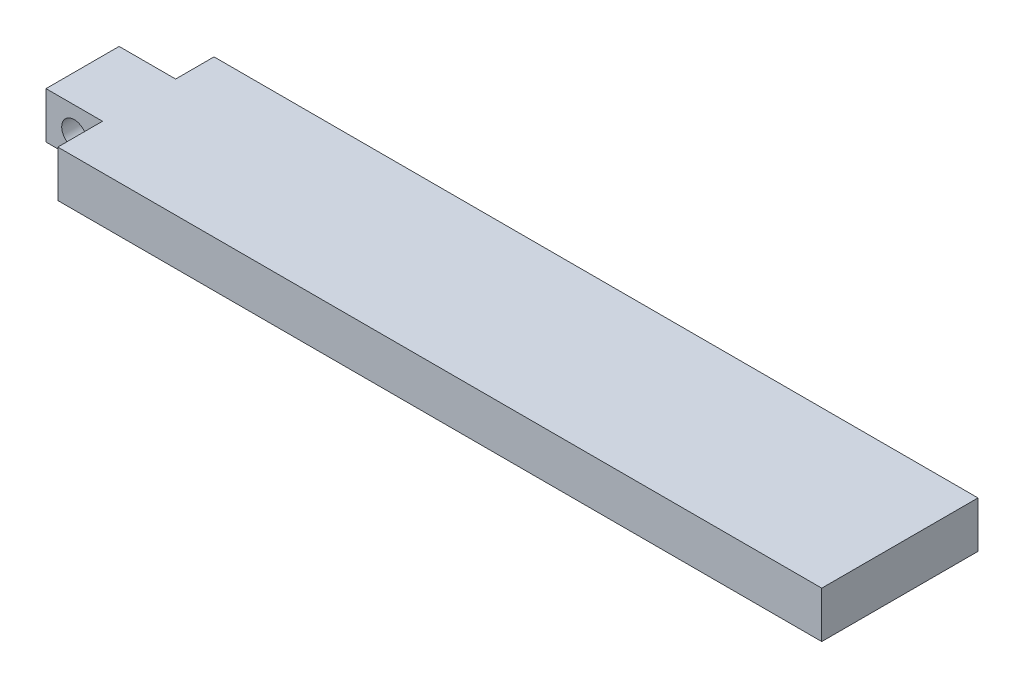
ISO-10303-21;
HEADER;
FILE_DESCRIPTION(('STEP AP214'),'2;1');
FILE_NAME('part.step','',(''),(''),'','','');
FILE_SCHEMA(('AUTOMOTIVE_DESIGN { 1 0 10303 214 1 1 1 1 }'));
ENDSEC;
DATA;
#1=APPLICATION_CONTEXT('core data for automotive mechanical design processes');
#2=APPLICATION_PROTOCOL_DEFINITION('international standard','automotive_design',2000,#1);
#3=PRODUCT_CONTEXT('',#1,'mechanical');
#4=PRODUCT('Part','Part','',(#3));
#5=PRODUCT_RELATED_PRODUCT_CATEGORY('part','',(#4));
#6=PRODUCT_DEFINITION_FORMATION('','',#4);
#7=PRODUCT_DEFINITION_CONTEXT('part definition',#1,'design');
#8=PRODUCT_DEFINITION('design','',#6,#7);
#9=PRODUCT_DEFINITION_SHAPE('','',#8);
#10=(LENGTH_UNIT() NAMED_UNIT(*) SI_UNIT(.MILLI.,.METRE.));
#11=(NAMED_UNIT(*) PLANE_ANGLE_UNIT() SI_UNIT($,.RADIAN.));
#12=(NAMED_UNIT(*) SI_UNIT($,.STERADIAN.) SOLID_ANGLE_UNIT());
#13=UNCERTAINTY_MEASURE_WITH_UNIT(LENGTH_MEASURE(1.E-05),#10,'distance_accuracy_value','');
#14=(GEOMETRIC_REPRESENTATION_CONTEXT(3) GLOBAL_UNCERTAINTY_ASSIGNED_CONTEXT((#13)) GLOBAL_UNIT_ASSIGNED_CONTEXT((#10,
#11,#12)) REPRESENTATION_CONTEXT('',''));
#15=CARTESIAN_POINT('',(0.,0.,0.));
#16=DIRECTION('',(0.,0.,1.));
#17=DIRECTION('',(1.,0.,0.));
#18=AXIS2_PLACEMENT_3D('',#15,#16,#17);
#19=CARTESIAN_POINT('',(161.751764330635,4.,-3.86426784554317));
#20=DIRECTION('',(0.,0.,-1.));
#21=DIRECTION('',(1.,0.,0.));
#22=AXIS2_PLACEMENT_3D('',#19,#20,#21);
#23=PLANE('',#22);
#24=CARTESIAN_POINT('',(93.316959872475,1.81723247665775,-3.86426784554317));
#25=DIRECTION('',(0.,0.,-1.));
#26=DIRECTION('',(-1.,0.,0.));
#27=AXIS2_PLACEMENT_3D('',#24,#25,#26);
#28=CIRCLE('',#27,1.08475397364903);
#29=CARTESIAN_POINT('',(92.232205898826,1.81723247665775,-3.86426784554317));
#30=VERTEX_POINT('',#29);
#31=EDGE_CURVE('E174',#30,#30,#28,.T.);
#32=ORIENTED_EDGE('',*,*,#31,.T.);
#33=EDGE_LOOP('',(#32));
#34=FACE_BOUND('',#33,.T.);
#35=DIRECTION('',(-1.,0.,0.));
#36=VECTOR('',#35,1.);
#37=CARTESIAN_POINT('',(161.751764330635,0.,-3.86426784554317));
#38=LINE('',#37,#36);
#39=CARTESIAN_POINT('',(95.7580375796323,0.,-3.86426784554317));
#40=VERTEX_POINT('',#39);
#41=CARTESIAN_POINT('',(90.8758821653177,0.,-3.86426784554317));
#42=VERTEX_POINT('',#41);
#43=EDGE_CURVE('E132',#40,#42,#38,.T.);
#44=ORIENTED_EDGE('',*,*,#43,.F.);
#45=DIRECTION('',(0.,-1.,0.));
#46=VECTOR('',#45,1.);
#47=CARTESIAN_POINT('',(95.7580375796323,4.,-3.86426784554317));
#48=LINE('',#47,#46);
#49=CARTESIAN_POINT('',(95.7580375796323,4.,-3.86426784554317));
#50=VERTEX_POINT('',#49);
#51=EDGE_CURVE('E146',#50,#40,#48,.T.);
#52=ORIENTED_EDGE('',*,*,#51,.F.);
#53=DIRECTION('',(-1.,0.,0.));
#54=VECTOR('',#53,1.);
#55=CARTESIAN_POINT('',(161.751764330635,4.,-3.86426784554317));
#56=LINE('',#55,#54);
#57=CARTESIAN_POINT('',(90.8758821653177,4.,-3.86426784554317));
#58=VERTEX_POINT('',#57);
#59=EDGE_CURVE('E169',#50,#58,#56,.T.);
#60=ORIENTED_EDGE('',*,*,#59,.T.);
#61=DIRECTION('',(0.,-1.,0.));
#62=VECTOR('',#61,1.);
#63=CARTESIAN_POINT('',(90.8758821653177,4.,-3.86426784554317));
#64=LINE('',#63,#62);
#65=EDGE_CURVE('E11',#58,#42,#64,.T.);
#66=ORIENTED_EDGE('',*,*,#65,.T.);
#67=EDGE_LOOP('',(#44,#52,#60,#66));
#68=FACE_BOUND('',#67,.T.);
#69=ADVANCED_FACE('F37',(#34,#68),#23,.F.);
#70=CARTESIAN_POINT('',(90.8758821653177,4.,0.));
#71=DIRECTION('',(1.,0.,0.));
#72=DIRECTION('',(0.,0.,1.));
#73=AXIS2_PLACEMENT_3D('',#70,#71,#72);
#74=PLANE('',#73);
#75=DIRECTION('',(0.,0.,-1.));
#76=VECTOR('',#75,1.);
#77=CARTESIAN_POINT('',(90.8758821653177,0.,0.));
#78=LINE('',#77,#76);
#79=CARTESIAN_POINT('',(90.8758821653177,0.,-10.1795813079235));
#80=VERTEX_POINT('',#79);
#81=EDGE_CURVE('E134',#42,#80,#78,.T.);
#82=ORIENTED_EDGE('',*,*,#81,.F.);
#83=ORIENTED_EDGE('',*,*,#65,.F.);
#84=DIRECTION('',(0.,0.,-1.));
#85=VECTOR('',#84,1.);
#86=CARTESIAN_POINT('',(90.8758821653177,4.,0.));
#87=LINE('',#86,#85);
#88=CARTESIAN_POINT('',(90.8758821653177,4.,-10.1795813079235));
#89=VERTEX_POINT('',#88);
#90=EDGE_CURVE('E92',#58,#89,#87,.T.);
#91=ORIENTED_EDGE('',*,*,#90,.T.);
#92=DIRECTION('',(0.,-1.,0.));
#93=VECTOR('',#92,1.);
#94=CARTESIAN_POINT('',(90.8758821653177,4.,-10.1795813079235));
#95=LINE('',#94,#93);
#96=EDGE_CURVE('E46',#89,#80,#95,.T.);
#97=ORIENTED_EDGE('',*,*,#96,.T.);
#98=EDGE_LOOP('',(#82,#83,#91,#97));
#99=FACE_BOUND('',#98,.T.);
#100=ADVANCED_FACE('F159',(#99),#74,.F.);
#101=CARTESIAN_POINT('',(161.751764330635,4.,-10.1795813079235));
#102=DIRECTION('',(0.,0.,-1.));
#103=DIRECTION('',(1.,0.,0.));
#104=AXIS2_PLACEMENT_3D('',#101,#102,#103);
#105=PLANE('',#104);
#106=CARTESIAN_POINT('',(93.316959872475,1.81723247665775,-10.1795813079235));
#107=DIRECTION('',(0.,0.,1.));
#108=DIRECTION('',(1.,0.,0.));
#109=AXIS2_PLACEMENT_3D('',#106,#107,#108);
#110=CIRCLE('',#109,1.08475397364903);
#111=CARTESIAN_POINT('',(94.401713846124,1.81723247665775,-10.1795813079235));
#112=VERTEX_POINT('',#111);
#113=EDGE_CURVE('E40',#112,#112,#110,.T.);
#114=ORIENTED_EDGE('',*,*,#113,.T.);
#115=EDGE_LOOP('',(#114));
#116=FACE_BOUND('',#115,.T.);
#117=DIRECTION('',(-1.,0.,0.));
#118=VECTOR('',#117,1.);
#119=CARTESIAN_POINT('',(161.751764330635,0.,-10.1795813079235));
#120=LINE('',#119,#118);
#121=CARTESIAN_POINT('',(95.7580375796323,0.,-10.1795813079235));
#122=VERTEX_POINT('',#121);
#123=EDGE_CURVE('E137',#122,#80,#120,.T.);
#124=ORIENTED_EDGE('',*,*,#123,.T.);
#125=ORIENTED_EDGE('',*,*,#96,.F.);
#126=DIRECTION('',(-1.,0.,0.));
#127=VECTOR('',#126,1.);
#128=CARTESIAN_POINT('',(161.751764330635,4.,-10.1795813079235));
#129=LINE('',#128,#127);
#130=CARTESIAN_POINT('',(95.7580375796323,4.,-10.1795813079235));
#131=VERTEX_POINT('',#130);
#132=EDGE_CURVE('E171',#131,#89,#129,.T.);
#133=ORIENTED_EDGE('',*,*,#132,.F.);
#134=DIRECTION('',(0.,-1.,0.));
#135=VECTOR('',#134,1.);
#136=CARTESIAN_POINT('',(95.7580375796323,4.,-10.1795813079235));
#137=LINE('',#136,#135);
#138=EDGE_CURVE('E153',#131,#122,#137,.T.);
#139=ORIENTED_EDGE('',*,*,#138,.T.);
#140=EDGE_LOOP('',(#124,#125,#133,#139));
#141=FACE_BOUND('',#140,.T.);
#142=ADVANCED_FACE('F181',(#116,#141),#105,.T.);
#143=CARTESIAN_POINT('',(95.7580375796323,4.,0.));
#144=DIRECTION('',(-1.,0.,0.));
#145=DIRECTION('',(0.,0.,-1.));
#146=AXIS2_PLACEMENT_3D('',#143,#144,#145);
#147=PLANE('',#146);
#148=DIRECTION('',(0.,0.,1.));
#149=VECTOR('',#148,1.);
#150=CARTESIAN_POINT('',(95.7580375796323,0.,0.));
#151=LINE('',#150,#149);
#152=CARTESIAN_POINT('',(95.7580375796323,0.,-13.498100823404));
#153=VERTEX_POINT('',#152);
#154=EDGE_CURVE('E139',#153,#122,#151,.T.);
#155=ORIENTED_EDGE('',*,*,#154,.T.);
#156=ORIENTED_EDGE('',*,*,#138,.F.);
#157=DIRECTION('',(0.,0.,1.));
#158=VECTOR('',#157,1.);
#159=CARTESIAN_POINT('',(95.7580375796323,4.,0.));
#160=LINE('',#159,#158);
#161=CARTESIAN_POINT('',(95.7580375796323,4.,-13.498100823404));
#162=VERTEX_POINT('',#161);
#163=EDGE_CURVE('E128',#162,#131,#160,.T.);
#164=ORIENTED_EDGE('',*,*,#163,.F.);
#165=DIRECTION('',(0.,-1.,0.));
#166=VECTOR('',#165,1.);
#167=CARTESIAN_POINT('',(95.7580375796323,4.,-13.498100823404));
#168=LINE('',#167,#166);
#169=EDGE_CURVE('E150',#162,#153,#168,.T.);
#170=ORIENTED_EDGE('',*,*,#169,.T.);
#171=EDGE_LOOP('',(#155,#156,#164,#170));
#172=FACE_BOUND('',#171,.T.);
#173=ADVANCED_FACE('F180',(#172),#147,.T.);
#174=CARTESIAN_POINT('',(161.751764330635,4.,-13.498100823404));
#175=DIRECTION('',(0.,0.,-1.));
#176=DIRECTION('',(1.,0.,0.));
#177=AXIS2_PLACEMENT_3D('',#174,#175,#176);
#178=PLANE('',#177);
#179=DIRECTION('',(-1.,0.,0.));
#180=VECTOR('',#179,1.);
#181=CARTESIAN_POINT('',(161.751764330635,0.,-13.498100823404));
#182=LINE('',#181,#180);
#183=CARTESIAN_POINT('',(161.751764330635,0.,-13.498100823404));
#184=VERTEX_POINT('',#183);
#185=EDGE_CURVE('E141',#184,#153,#182,.T.);
#186=ORIENTED_EDGE('',*,*,#185,.T.);
#187=ORIENTED_EDGE('',*,*,#169,.F.);
#188=DIRECTION('',(-1.,0.,0.));
#189=VECTOR('',#188,1.);
#190=CARTESIAN_POINT('',(161.751764330635,4.,-13.498100823404));
#191=LINE('',#190,#189);
#192=CARTESIAN_POINT('',(161.751764330635,4.,-13.498100823404));
#193=VERTEX_POINT('',#192);
#194=EDGE_CURVE('E126',#193,#162,#191,.T.);
#195=ORIENTED_EDGE('',*,*,#194,.F.);
#196=DIRECTION('',(0.,-1.,0.));
#197=VECTOR('',#196,1.);
#198=CARTESIAN_POINT('',(161.751764330635,4.,-13.498100823404));
#199=LINE('',#198,#197);
#200=EDGE_CURVE('E120',#193,#184,#199,.T.);
#201=ORIENTED_EDGE('',*,*,#200,.T.);
#202=EDGE_LOOP('',(#186,#187,#195,#201));
#203=FACE_BOUND('',#202,.T.);
#204=ADVANCED_FACE('F189',(#203),#178,.T.);
#205=CARTESIAN_POINT('',(161.751764330635,4.,0.));
#206=DIRECTION('',(1.,0.,0.));
#207=DIRECTION('',(0.,0.,1.));
#208=AXIS2_PLACEMENT_3D('',#205,#206,#207);
#209=PLANE('',#208);
#210=DIRECTION('',(0.,0.,-1.));
#211=VECTOR('',#210,1.);
#212=CARTESIAN_POINT('',(161.751764330635,0.,0.));
#213=LINE('',#212,#211);
#214=CARTESIAN_POINT('',(161.751764330635,0.,0.));
#215=VERTEX_POINT('',#214);
#216=EDGE_CURVE('E143',#215,#184,#213,.T.);
#217=ORIENTED_EDGE('',*,*,#216,.T.);
#218=ORIENTED_EDGE('',*,*,#200,.F.);
#219=DIRECTION('',(0.,0.,-1.));
#220=VECTOR('',#219,1.);
#221=CARTESIAN_POINT('',(161.751764330635,4.,0.));
#222=LINE('',#221,#220);
#223=CARTESIAN_POINT('',(161.751764330635,4.,0.));
#224=VERTEX_POINT('',#223);
#225=EDGE_CURVE('E110',#224,#193,#222,.T.);
#226=ORIENTED_EDGE('',*,*,#225,.F.);
#227=DIRECTION('',(0.,-1.,0.));
#228=VECTOR('',#227,1.);
#229=CARTESIAN_POINT('',(161.751764330635,4.,0.));
#230=LINE('',#229,#228);
#231=EDGE_CURVE('E115',#224,#215,#230,.T.);
#232=ORIENTED_EDGE('',*,*,#231,.T.);
#233=EDGE_LOOP('',(#217,#218,#226,#232));
#234=FACE_BOUND('',#233,.T.);
#235=ADVANCED_FACE('F123',(#234),#209,.T.);
#236=CARTESIAN_POINT('',(161.751764330635,4.,0.));
#237=DIRECTION('',(0.,0.,-1.));
#238=DIRECTION('',(1.,0.,0.));
#239=AXIS2_PLACEMENT_3D('',#236,#237,#238);
#240=PLANE('',#239);
#241=DIRECTION('',(-1.,0.,0.));
#242=VECTOR('',#241,1.);
#243=CARTESIAN_POINT('',(161.751764330635,0.,0.));
#244=LINE('',#243,#242);
#245=CARTESIAN_POINT('',(95.7580375796323,0.,0.));
#246=VERTEX_POINT('',#245);
#247=EDGE_CURVE('E117',#215,#246,#244,.T.);
#248=ORIENTED_EDGE('',*,*,#247,.F.);
#249=ORIENTED_EDGE('',*,*,#231,.F.);
#250=DIRECTION('',(-1.,0.,0.));
#251=VECTOR('',#250,1.);
#252=CARTESIAN_POINT('',(161.751764330635,4.,0.));
#253=LINE('',#252,#251);
#254=CARTESIAN_POINT('',(95.7580375796323,4.,0.));
#255=VERTEX_POINT('',#254);
#256=EDGE_CURVE('E106',#224,#255,#253,.T.);
#257=ORIENTED_EDGE('',*,*,#256,.T.);
#258=DIRECTION('',(0.,-1.,0.));
#259=VECTOR('',#258,1.);
#260=CARTESIAN_POINT('',(95.7580375796323,4.,0.));
#261=LINE('',#260,#259);
#262=EDGE_CURVE('E121',#255,#246,#261,.T.);
#263=ORIENTED_EDGE('',*,*,#262,.T.);
#264=EDGE_LOOP('',(#248,#249,#257,#263));
#265=FACE_BOUND('',#264,.T.);
#266=ADVANCED_FACE('F116',(#265),#240,.F.);
#267=EDGE_CURVE('E80',#40,#246,#151,.T.);
#268=ORIENTED_EDGE('',*,*,#267,.T.);
#269=ORIENTED_EDGE('',*,*,#262,.F.);
#270=EDGE_CURVE('E54',#50,#255,#160,.T.);
#271=ORIENTED_EDGE('',*,*,#270,.F.);
#272=ORIENTED_EDGE('',*,*,#51,.T.);
#273=EDGE_LOOP('',(#268,#269,#271,#272));
#274=FACE_BOUND('',#273,.T.);
#275=ADVANCED_FACE('F191',(#274),#147,.T.);
#276=CARTESIAN_POINT('',(161.751764330635,4.,0.));
#277=DIRECTION('',(0.,1.,0.));
#278=DIRECTION('',(0.,0.,1.));
#279=AXIS2_PLACEMENT_3D('',#276,#277,#278);
#280=PLANE('',#279);
#281=ORIENTED_EDGE('',*,*,#59,.F.);
#282=ORIENTED_EDGE('',*,*,#270,.T.);
#283=ORIENTED_EDGE('',*,*,#256,.F.);
#284=ORIENTED_EDGE('',*,*,#225,.T.);
#285=ORIENTED_EDGE('',*,*,#194,.T.);
#286=ORIENTED_EDGE('',*,*,#163,.T.);
#287=ORIENTED_EDGE('',*,*,#132,.T.);
#288=ORIENTED_EDGE('',*,*,#90,.F.);
#289=EDGE_LOOP('',(#281,#282,#283,#284,#285,#286,#287,#288));
#290=FACE_BOUND('',#289,.T.);
#291=ADVANCED_FACE('F108',(#290),#280,.T.);
#292=CARTESIAN_POINT('',(161.751764330635,0.,0.));
#293=DIRECTION('',(0.,1.,0.));
#294=DIRECTION('',(0.,0.,1.));
#295=AXIS2_PLACEMENT_3D('',#292,#293,#294);
#296=PLANE('',#295);
#297=ORIENTED_EDGE('',*,*,#43,.T.);
#298=ORIENTED_EDGE('',*,*,#81,.T.);
#299=ORIENTED_EDGE('',*,*,#123,.F.);
#300=ORIENTED_EDGE('',*,*,#154,.F.);
#301=ORIENTED_EDGE('',*,*,#185,.F.);
#302=ORIENTED_EDGE('',*,*,#216,.F.);
#303=ORIENTED_EDGE('',*,*,#247,.T.);
#304=ORIENTED_EDGE('',*,*,#267,.F.);
#305=EDGE_LOOP('',(#297,#298,#299,#300,#301,#302,#303,#304));
#306=FACE_BOUND('',#305,.T.);
#307=ADVANCED_FACE('F163',(#306),#296,.F.);
#308=CARTESIAN_POINT('',(93.316959872475,1.81723247665775,-13.498100823404));
#309=DIRECTION('',(0.,0.,1.));
#310=DIRECTION('',(-1.,0.,0.));
#311=AXIS2_PLACEMENT_3D('',#308,#309,#310);
#312=CYLINDRICAL_SURFACE('',#311,1.08475397364903);
#313=ORIENTED_EDGE('',*,*,#113,.F.);
#314=EDGE_LOOP('',(#313));
#315=FACE_BOUND('',#314,.T.);
#316=ORIENTED_EDGE('',*,*,#31,.F.);
#317=EDGE_LOOP('',(#316));
#318=FACE_BOUND('',#317,.T.);
#319=ADVANCED_FACE('F203',(#315,#318),#312,.F.);
#320=CLOSED_SHELL('',(#69,#100,#142,#173,#204,#235,#266,#275,#291,#307,#319));
#321=MANIFOLD_SOLID_BREP('B2',#320);
#322=ADVANCED_BREP_SHAPE_REPRESENTATION('',(#18,#321),#14);
#323=SHAPE_DEFINITION_REPRESENTATION(#9,#322);
ENDSEC;
END-ISO-10303-21;
